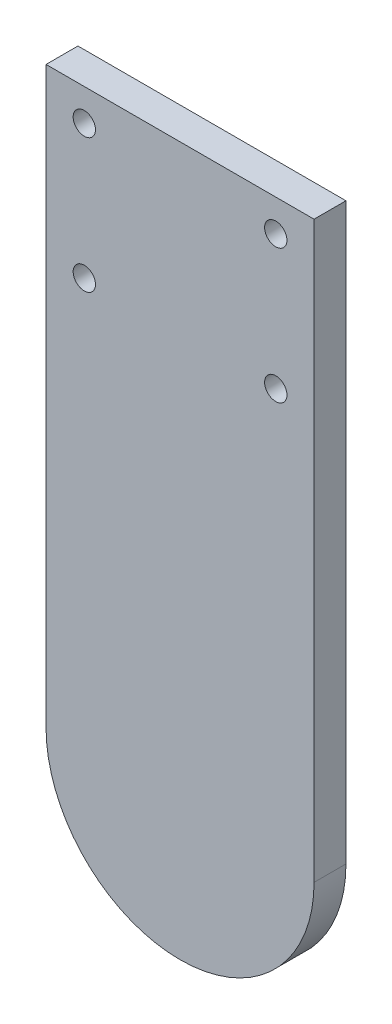
ISO-10303-21;
HEADER;
FILE_DESCRIPTION(('STEP AP214'),'2;1');
FILE_NAME('part.step','',(''),(''),'','','');
FILE_SCHEMA(('AUTOMOTIVE_DESIGN { 1 0 10303 214 1 1 1 1 }'));
ENDSEC;
DATA;
#1=APPLICATION_CONTEXT('core data for automotive mechanical design processes');
#2=APPLICATION_PROTOCOL_DEFINITION('international standard','automotive_design',2000,#1);
#3=PRODUCT_CONTEXT('',#1,'mechanical');
#4=PRODUCT('Part','Part','',(#3));
#5=PRODUCT_RELATED_PRODUCT_CATEGORY('part','',(#4));
#6=PRODUCT_DEFINITION_FORMATION('','',#4);
#7=PRODUCT_DEFINITION_CONTEXT('part definition',#1,'design');
#8=PRODUCT_DEFINITION('design','',#6,#7);
#9=PRODUCT_DEFINITION_SHAPE('','',#8);
#10=(LENGTH_UNIT() NAMED_UNIT(*) SI_UNIT(.MILLI.,.METRE.));
#11=(NAMED_UNIT(*) PLANE_ANGLE_UNIT() SI_UNIT($,.RADIAN.));
#12=(NAMED_UNIT(*) SI_UNIT($,.STERADIAN.) SOLID_ANGLE_UNIT());
#13=UNCERTAINTY_MEASURE_WITH_UNIT(LENGTH_MEASURE(1.E-05),#10,'distance_accuracy_value','');
#14=(GEOMETRIC_REPRESENTATION_CONTEXT(3) GLOBAL_UNCERTAINTY_ASSIGNED_CONTEXT((#13)) GLOBAL_UNIT_ASSIGNED_CONTEXT((#10,
#11,#12)) REPRESENTATION_CONTEXT('',''));
#15=CARTESIAN_POINT('',(0.,0.,0.));
#16=DIRECTION('',(0.,0.,1.));
#17=DIRECTION('',(1.,0.,0.));
#18=AXIS2_PLACEMENT_3D('',#15,#16,#17);
#19=CARTESIAN_POINT('',(0.,0.,0.));
#20=DIRECTION('',(0.,0.,1.));
#21=DIRECTION('',(1.,0.,0.));
#22=AXIS2_PLACEMENT_3D('',#19,#20,#21);
#23=PLANE('',#22);
#24=CARTESIAN_POINT('',(0.,0.,0.));
#25=DIRECTION('',(0.,0.,1.));
#26=DIRECTION('',(1.,0.,0.));
#27=AXIS2_PLACEMENT_3D('',#24,#25,#26);
#28=CIRCLE('',#27,21.);
#29=CARTESIAN_POINT('',(-21.,0.,0.));
#30=VERTEX_POINT('',#29);
#31=CARTESIAN_POINT('',(21.,0.,0.));
#32=VERTEX_POINT('',#31);
#33=EDGE_CURVE('E102',#30,#32,#28,.T.);
#34=ORIENTED_EDGE('',*,*,#33,.F.);
#35=DIRECTION('',(0.,-1.,0.));
#36=VECTOR('',#35,1.);
#37=CARTESIAN_POINT('',(-21.,0.,0.));
#38=LINE('',#37,#36);
#39=CARTESIAN_POINT('',(-21.,90.,0.));
#40=VERTEX_POINT('',#39);
#41=EDGE_CURVE('E75',#40,#30,#38,.T.);
#42=ORIENTED_EDGE('',*,*,#41,.F.);
#43=DIRECTION('',(-1.,0.,0.));
#44=VECTOR('',#43,1.);
#45=CARTESIAN_POINT('',(-21.,90.,0.));
#46=LINE('',#45,#44);
#47=CARTESIAN_POINT('',(21.,90.,0.));
#48=VERTEX_POINT('',#47);
#49=EDGE_CURVE('E69',#48,#40,#46,.T.);
#50=ORIENTED_EDGE('',*,*,#49,.F.);
#51=DIRECTION('',(0.,1.,0.));
#52=VECTOR('',#51,1.);
#53=CARTESIAN_POINT('',(21.,0.,0.));
#54=LINE('',#53,#52);
#55=EDGE_CURVE('E93',#32,#48,#54,.T.);
#56=ORIENTED_EDGE('',*,*,#55,.F.);
#57=EDGE_LOOP('',(#34,#42,#50,#56));
#58=FACE_BOUND('',#57,.T.);
#59=CARTESIAN_POINT('',(15.,85.,0.));
#60=DIRECTION('',(0.,0.,-1.));
#61=DIRECTION('',(-1.,0.,0.));
#62=AXIS2_PLACEMENT_3D('',#59,#60,#61);
#63=CIRCLE('',#62,1.75);
#64=CARTESIAN_POINT('',(13.25,85.,0.));
#65=VERTEX_POINT('',#64);
#66=EDGE_CURVE('E119',#65,#65,#63,.T.);
#67=ORIENTED_EDGE('',*,*,#66,.F.);
#68=EDGE_LOOP('',(#67));
#69=FACE_BOUND('',#68,.T.);
#70=CARTESIAN_POINT('',(15.,64.,0.));
#71=DIRECTION('',(0.,0.,-1.));
#72=DIRECTION('',(-1.,0.,0.));
#73=AXIS2_PLACEMENT_3D('',#70,#71,#72);
#74=CIRCLE('',#73,1.75);
#75=CARTESIAN_POINT('',(13.25,64.,0.));
#76=VERTEX_POINT('',#75);
#77=EDGE_CURVE('E123',#76,#76,#74,.T.);
#78=ORIENTED_EDGE('',*,*,#77,.F.);
#79=EDGE_LOOP('',(#78));
#80=FACE_BOUND('',#79,.T.);
#81=CARTESIAN_POINT('',(-15.,64.,0.));
#82=DIRECTION('',(0.,0.,-1.));
#83=DIRECTION('',(1.,0.,0.));
#84=AXIS2_PLACEMENT_3D('',#81,#82,#83);
#85=CIRCLE('',#84,1.75);
#86=CARTESIAN_POINT('',(-13.25,64.,0.));
#87=VERTEX_POINT('',#86);
#88=EDGE_CURVE('E127',#87,#87,#85,.T.);
#89=ORIENTED_EDGE('',*,*,#88,.F.);
#90=EDGE_LOOP('',(#89));
#91=FACE_BOUND('',#90,.T.);
#92=CARTESIAN_POINT('',(-15.,85.,0.));
#93=DIRECTION('',(0.,0.,-1.));
#94=DIRECTION('',(1.,0.,0.));
#95=AXIS2_PLACEMENT_3D('',#92,#93,#94);
#96=CIRCLE('',#95,1.75);
#97=CARTESIAN_POINT('',(-13.25,85.,0.));
#98=VERTEX_POINT('',#97);
#99=EDGE_CURVE('E131',#98,#98,#96,.T.);
#100=ORIENTED_EDGE('',*,*,#99,.F.);
#101=EDGE_LOOP('',(#100));
#102=FACE_BOUND('',#101,.T.);
#103=CARTESIAN_POINT('',(0.,0.,0.));
#104=DIRECTION('',(0.,0.,1.));
#105=DIRECTION('',(1.,0.,0.));
#106=AXIS2_PLACEMENT_3D('',#103,#104,#105);
#107=CIRCLE('',#106,6.);
#108=CARTESIAN_POINT('',(6.,0.,0.));
#109=VERTEX_POINT('',#108);
#110=EDGE_CURVE('E11',#109,#109,#107,.F.);
#111=ORIENTED_EDGE('',*,*,#110,.F.);
#112=EDGE_LOOP('',(#111));
#113=FACE_BOUND('',#112,.T.);
#114=ADVANCED_FACE('F35',(#58,#69,#80,#91,#102,#113),#23,.F.);
#115=CARTESIAN_POINT('',(0.,0.,5.));
#116=DIRECTION('',(0.,0.,-1.));
#117=DIRECTION('',(-1.,0.,0.));
#118=AXIS2_PLACEMENT_3D('',#115,#116,#117);
#119=CYLINDRICAL_SURFACE('',#118,21.);
#120=ORIENTED_EDGE('',*,*,#33,.T.);
#121=DIRECTION('',(0.,0.,-1.));
#122=VECTOR('',#121,1.);
#123=CARTESIAN_POINT('',(21.,0.,5.));
#124=LINE('',#123,#122);
#125=CARTESIAN_POINT('',(21.,0.,5.));
#126=VERTEX_POINT('',#125);
#127=EDGE_CURVE('E44',#126,#32,#124,.T.);
#128=ORIENTED_EDGE('',*,*,#127,.F.);
#129=CARTESIAN_POINT('',(0.,0.,5.));
#130=DIRECTION('',(0.,0.,1.));
#131=DIRECTION('',(1.,0.,0.));
#132=AXIS2_PLACEMENT_3D('',#129,#130,#131);
#133=CIRCLE('',#132,21.);
#134=CARTESIAN_POINT('',(-21.,0.,5.));
#135=VERTEX_POINT('',#134);
#136=EDGE_CURVE('E88',#135,#126,#133,.T.);
#137=ORIENTED_EDGE('',*,*,#136,.F.);
#138=DIRECTION('',(0.,0.,-1.));
#139=VECTOR('',#138,1.);
#140=CARTESIAN_POINT('',(-21.,0.,5.));
#141=LINE('',#140,#139);
#142=EDGE_CURVE('E98',#135,#30,#141,.T.);
#143=ORIENTED_EDGE('',*,*,#142,.T.);
#144=EDGE_LOOP('',(#120,#128,#137,#143));
#145=FACE_BOUND('',#144,.T.);
#146=ADVANCED_FACE('F37',(#145),#119,.T.);
#147=CARTESIAN_POINT('',(21.,0.,5.));
#148=DIRECTION('',(-1.,0.,0.));
#149=DIRECTION('',(0.,0.,1.));
#150=AXIS2_PLACEMENT_3D('',#147,#148,#149);
#151=PLANE('',#150);
#152=ORIENTED_EDGE('',*,*,#55,.T.);
#153=DIRECTION('',(0.,0.,-1.));
#154=VECTOR('',#153,1.);
#155=CARTESIAN_POINT('',(21.,90.,5.));
#156=LINE('',#155,#154);
#157=CARTESIAN_POINT('',(21.,90.,5.));
#158=VERTEX_POINT('',#157);
#159=EDGE_CURVE('E91',#158,#48,#156,.T.);
#160=ORIENTED_EDGE('',*,*,#159,.F.);
#161=DIRECTION('',(0.,1.,0.));
#162=VECTOR('',#161,1.);
#163=CARTESIAN_POINT('',(21.,0.,5.));
#164=LINE('',#163,#162);
#165=EDGE_CURVE('E83',#126,#158,#164,.T.);
#166=ORIENTED_EDGE('',*,*,#165,.F.);
#167=ORIENTED_EDGE('',*,*,#127,.T.);
#168=EDGE_LOOP('',(#152,#160,#166,#167));
#169=FACE_BOUND('',#168,.T.);
#170=ADVANCED_FACE('F92',(#169),#151,.F.);
#171=CARTESIAN_POINT('',(-21.,90.,5.));
#172=DIRECTION('',(0.,-1.,0.));
#173=DIRECTION('',(0.,0.,-1.));
#174=AXIS2_PLACEMENT_3D('',#171,#172,#173);
#175=PLANE('',#174);
#176=ORIENTED_EDGE('',*,*,#49,.T.);
#177=DIRECTION('',(0.,0.,-1.));
#178=VECTOR('',#177,1.);
#179=CARTESIAN_POINT('',(-21.,90.,5.));
#180=LINE('',#179,#178);
#181=CARTESIAN_POINT('',(-21.,90.,5.));
#182=VERTEX_POINT('',#181);
#183=EDGE_CURVE('E94',#182,#40,#180,.T.);
#184=ORIENTED_EDGE('',*,*,#183,.F.);
#185=DIRECTION('',(-1.,0.,0.));
#186=VECTOR('',#185,1.);
#187=CARTESIAN_POINT('',(-21.,90.,5.));
#188=LINE('',#187,#186);
#189=EDGE_CURVE('E86',#158,#182,#188,.T.);
#190=ORIENTED_EDGE('',*,*,#189,.F.);
#191=ORIENTED_EDGE('',*,*,#159,.T.);
#192=EDGE_LOOP('',(#176,#184,#190,#191));
#193=FACE_BOUND('',#192,.T.);
#194=ADVANCED_FACE('F96',(#193),#175,.F.);
#195=CARTESIAN_POINT('',(-21.,0.,5.));
#196=DIRECTION('',(1.,0.,0.));
#197=DIRECTION('',(0.,0.,-1.));
#198=AXIS2_PLACEMENT_3D('',#195,#196,#197);
#199=PLANE('',#198);
#200=ORIENTED_EDGE('',*,*,#41,.T.);
#201=ORIENTED_EDGE('',*,*,#142,.F.);
#202=DIRECTION('',(0.,-1.,0.));
#203=VECTOR('',#202,1.);
#204=CARTESIAN_POINT('',(-21.,0.,5.));
#205=LINE('',#204,#203);
#206=EDGE_CURVE('E52',#182,#135,#205,.T.);
#207=ORIENTED_EDGE('',*,*,#206,.F.);
#208=ORIENTED_EDGE('',*,*,#183,.T.);
#209=EDGE_LOOP('',(#200,#201,#207,#208));
#210=FACE_BOUND('',#209,.T.);
#211=ADVANCED_FACE('F171',(#210),#199,.F.);
#212=CARTESIAN_POINT('',(0.,0.,5.));
#213=DIRECTION('',(0.,0.,1.));
#214=DIRECTION('',(1.,0.,0.));
#215=AXIS2_PLACEMENT_3D('',#212,#213,#214);
#216=PLANE('',#215);
#217=CARTESIAN_POINT('',(-15.,85.,5.));
#218=DIRECTION('',(0.,0.,-1.));
#219=DIRECTION('',(1.,0.,0.));
#220=AXIS2_PLACEMENT_3D('',#217,#218,#219);
#221=CIRCLE('',#220,1.75);
#222=CARTESIAN_POINT('',(-13.25,85.,5.));
#223=VERTEX_POINT('',#222);
#224=EDGE_CURVE('E267',#223,#223,#221,.T.);
#225=ORIENTED_EDGE('',*,*,#224,.T.);
#226=EDGE_LOOP('',(#225));
#227=FACE_BOUND('',#226,.T.);
#228=CARTESIAN_POINT('',(-15.,64.,5.));
#229=DIRECTION('',(0.,0.,-1.));
#230=DIRECTION('',(1.,0.,0.));
#231=AXIS2_PLACEMENT_3D('',#228,#229,#230);
#232=CIRCLE('',#231,1.75);
#233=CARTESIAN_POINT('',(-13.25,64.,5.));
#234=VERTEX_POINT('',#233);
#235=EDGE_CURVE('E271',#234,#234,#232,.T.);
#236=ORIENTED_EDGE('',*,*,#235,.T.);
#237=EDGE_LOOP('',(#236));
#238=FACE_BOUND('',#237,.T.);
#239=CARTESIAN_POINT('',(15.,64.,5.));
#240=DIRECTION('',(0.,0.,-1.));
#241=DIRECTION('',(-1.,0.,0.));
#242=AXIS2_PLACEMENT_3D('',#239,#240,#241);
#243=CIRCLE('',#242,1.75);
#244=CARTESIAN_POINT('',(13.25,64.,5.));
#245=VERTEX_POINT('',#244);
#246=EDGE_CURVE('E275',#245,#245,#243,.T.);
#247=ORIENTED_EDGE('',*,*,#246,.T.);
#248=EDGE_LOOP('',(#247));
#249=FACE_BOUND('',#248,.T.);
#250=CARTESIAN_POINT('',(15.,85.,5.));
#251=DIRECTION('',(0.,0.,-1.));
#252=DIRECTION('',(-1.,0.,0.));
#253=AXIS2_PLACEMENT_3D('',#250,#251,#252);
#254=CIRCLE('',#253,1.75);
#255=CARTESIAN_POINT('',(13.25,85.,5.));
#256=VERTEX_POINT('',#255);
#257=EDGE_CURVE('E105',#256,#256,#254,.T.);
#258=ORIENTED_EDGE('',*,*,#257,.T.);
#259=EDGE_LOOP('',(#258));
#260=FACE_BOUND('',#259,.T.);
#261=ORIENTED_EDGE('',*,*,#136,.T.);
#262=ORIENTED_EDGE('',*,*,#165,.T.);
#263=ORIENTED_EDGE('',*,*,#189,.T.);
#264=ORIENTED_EDGE('',*,*,#206,.T.);
#265=EDGE_LOOP('',(#261,#262,#263,#264));
#266=FACE_BOUND('',#265,.T.);
#267=ADVANCED_FACE('F84',(#227,#238,#249,#260,#266),#216,.T.);
#268=CARTESIAN_POINT('',(15.,85.,5.));
#269=DIRECTION('',(0.,0.,-1.));
#270=DIRECTION('',(-1.,0.,0.));
#271=AXIS2_PLACEMENT_3D('',#268,#269,#270);
#272=CYLINDRICAL_SURFACE('',#271,1.75);
#273=ORIENTED_EDGE('',*,*,#257,.F.);
#274=EDGE_LOOP('',(#273));
#275=FACE_BOUND('',#274,.T.);
#276=ORIENTED_EDGE('',*,*,#66,.T.);
#277=EDGE_LOOP('',(#276));
#278=FACE_BOUND('',#277,.T.);
#279=ADVANCED_FACE('F165',(#275,#278),#272,.F.);
#280=CARTESIAN_POINT('',(15.,64.,5.));
#281=DIRECTION('',(0.,0.,-1.));
#282=DIRECTION('',(-1.,0.,0.));
#283=AXIS2_PLACEMENT_3D('',#280,#281,#282);
#284=CYLINDRICAL_SURFACE('',#283,1.75);
#285=ORIENTED_EDGE('',*,*,#246,.F.);
#286=EDGE_LOOP('',(#285));
#287=FACE_BOUND('',#286,.T.);
#288=ORIENTED_EDGE('',*,*,#77,.T.);
#289=EDGE_LOOP('',(#288));
#290=FACE_BOUND('',#289,.T.);
#291=ADVANCED_FACE('F161',(#287,#290),#284,.F.);
#292=CARTESIAN_POINT('',(-15.,64.,5.));
#293=DIRECTION('',(0.,0.,-1.));
#294=DIRECTION('',(-1.,0.,0.));
#295=AXIS2_PLACEMENT_3D('',#292,#293,#294);
#296=CYLINDRICAL_SURFACE('',#295,1.75);
#297=ORIENTED_EDGE('',*,*,#235,.F.);
#298=EDGE_LOOP('',(#297));
#299=FACE_BOUND('',#298,.T.);
#300=ORIENTED_EDGE('',*,*,#88,.T.);
#301=EDGE_LOOP('',(#300));
#302=FACE_BOUND('',#301,.T.);
#303=ADVANCED_FACE('F157',(#299,#302),#296,.F.);
#304=CARTESIAN_POINT('',(-15.,85.,5.));
#305=DIRECTION('',(0.,0.,-1.));
#306=DIRECTION('',(-1.,0.,0.));
#307=AXIS2_PLACEMENT_3D('',#304,#305,#306);
#308=CYLINDRICAL_SURFACE('',#307,1.75);
#309=ORIENTED_EDGE('',*,*,#224,.F.);
#310=EDGE_LOOP('',(#309));
#311=FACE_BOUND('',#310,.T.);
#312=ORIENTED_EDGE('',*,*,#99,.T.);
#313=EDGE_LOOP('',(#312));
#314=FACE_BOUND('',#313,.T.);
#315=ADVANCED_FACE('F147',(#311,#314),#308,.F.);
#316=CARTESIAN_POINT('',(0.,0.,-1.));
#317=DIRECTION('',(0.,0.,-1.));
#318=DIRECTION('',(-1.,0.,0.));
#319=AXIS2_PLACEMENT_3D('',#316,#317,#318);
#320=PLANE('',#319);
#321=CARTESIAN_POINT('',(0.,0.,-1.));
#322=DIRECTION('',(0.,0.,-1.));
#323=DIRECTION('',(-1.,0.,0.));
#324=AXIS2_PLACEMENT_3D('',#321,#322,#323);
#325=CIRCLE('',#324,6.);
#326=CARTESIAN_POINT('',(-6.,0.,-1.));
#327=VERTEX_POINT('',#326);
#328=EDGE_CURVE('E290',#327,#327,#325,.T.);
#329=ORIENTED_EDGE('',*,*,#328,.T.);
#330=EDGE_LOOP('',(#329));
#331=FACE_BOUND('',#330,.T.);
#332=CARTESIAN_POINT('',(0.,0.,-1.));
#333=DIRECTION('',(0.,0.,-1.));
#334=DIRECTION('',(-1.,0.,0.));
#335=AXIS2_PLACEMENT_3D('',#332,#333,#334);
#336=CIRCLE('',#335,4.);
#337=CARTESIAN_POINT('',(-4.,0.,-1.));
#338=VERTEX_POINT('',#337);
#339=EDGE_CURVE('E293',#338,#338,#336,.T.);
#340=ORIENTED_EDGE('',*,*,#339,.F.);
#341=EDGE_LOOP('',(#340));
#342=FACE_BOUND('',#341,.T.);
#343=ADVANCED_FACE('F137',(#331,#342),#320,.T.);
#344=CARTESIAN_POINT('',(0.,0.,-1.));
#345=DIRECTION('',(0.,0.,1.));
#346=DIRECTION('',(1.,0.,0.));
#347=AXIS2_PLACEMENT_3D('',#344,#345,#346);
#348=CYLINDRICAL_SURFACE('',#347,6.);
#349=ORIENTED_EDGE('',*,*,#328,.F.);
#350=EDGE_LOOP('',(#349));
#351=FACE_BOUND('',#350,.T.);
#352=ORIENTED_EDGE('',*,*,#110,.T.);
#353=EDGE_LOOP('',(#352));
#354=FACE_BOUND('',#353,.T.);
#355=ADVANCED_FACE('F134',(#351,#354),#348,.T.);
#356=CARTESIAN_POINT('',(0.,0.,3.));
#357=DIRECTION('',(0.,0.,-1.));
#358=DIRECTION('',(-1.,0.,0.));
#359=AXIS2_PLACEMENT_3D('',#356,#357,#358);
#360=PLANE('',#359);
#361=CARTESIAN_POINT('',(0.,0.,3.));
#362=DIRECTION('',(0.,0.,-1.));
#363=DIRECTION('',(-1.,0.,0.));
#364=AXIS2_PLACEMENT_3D('',#361,#362,#363);
#365=CIRCLE('',#364,4.);
#366=CARTESIAN_POINT('',(-4.,0.,3.));
#367=VERTEX_POINT('',#366);
#368=EDGE_CURVE('E286',#367,#367,#365,.T.);
#369=ORIENTED_EDGE('',*,*,#368,.T.);
#370=EDGE_LOOP('',(#369));
#371=FACE_BOUND('',#370,.T.);
#372=ADVANCED_FACE('F136',(#371),#360,.T.);
#373=CARTESIAN_POINT('',(0.,0.,3.));
#374=DIRECTION('',(0.,0.,-1.));
#375=DIRECTION('',(-1.,0.,0.));
#376=AXIS2_PLACEMENT_3D('',#373,#374,#375);
#377=CYLINDRICAL_SURFACE('',#376,4.);
#378=ORIENTED_EDGE('',*,*,#368,.F.);
#379=EDGE_LOOP('',(#378));
#380=FACE_BOUND('',#379,.T.);
#381=ORIENTED_EDGE('',*,*,#339,.T.);
#382=EDGE_LOOP('',(#381));
#383=FACE_BOUND('',#382,.T.);
#384=ADVANCED_FACE('F144',(#380,#383),#377,.F.);
#385=CLOSED_SHELL('',(#114,#146,#170,#194,#211,#267,#279,#291,#303,#315,#343,#355,#372,#384));
#386=MANIFOLD_SOLID_BREP('B2',#385);
#387=ADVANCED_BREP_SHAPE_REPRESENTATION('',(#18,#386),#14);
#388=SHAPE_DEFINITION_REPRESENTATION(#9,#387);
ENDSEC;
END-ISO-10303-21;
